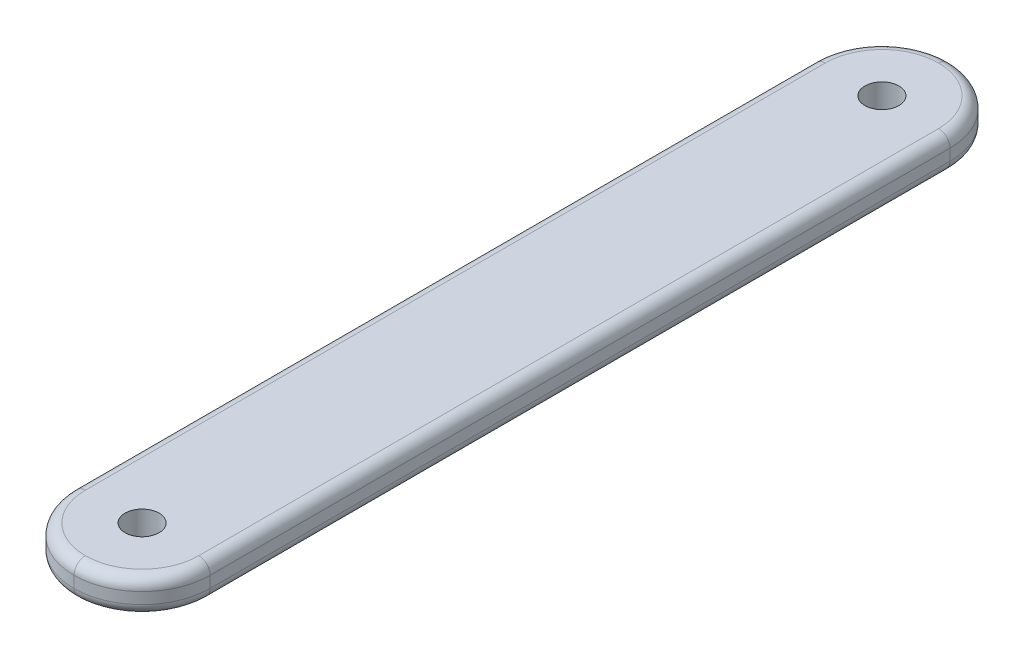
ISO-10303-21;
HEADER;
FILE_DESCRIPTION(('STEP AP214'),'2;1');
FILE_NAME('part.step','',(''),(''),'','','');
FILE_SCHEMA(('AUTOMOTIVE_DESIGN { 1 0 10303 214 1 1 1 1 }'));
ENDSEC;
DATA;
#1=APPLICATION_CONTEXT('core data for automotive mechanical design processes');
#2=APPLICATION_PROTOCOL_DEFINITION('international standard','automotive_design',2000,#1);
#3=PRODUCT_CONTEXT('',#1,'mechanical');
#4=PRODUCT('Part','Part','',(#3));
#5=PRODUCT_RELATED_PRODUCT_CATEGORY('part','',(#4));
#6=PRODUCT_DEFINITION_FORMATION('','',#4);
#7=PRODUCT_DEFINITION_CONTEXT('part definition',#1,'design');
#8=PRODUCT_DEFINITION('design','',#6,#7);
#9=PRODUCT_DEFINITION_SHAPE('','',#8);
#10=(LENGTH_UNIT() NAMED_UNIT(*) SI_UNIT(.MILLI.,.METRE.));
#11=(NAMED_UNIT(*) PLANE_ANGLE_UNIT() SI_UNIT($,.RADIAN.));
#12=(NAMED_UNIT(*) SI_UNIT($,.STERADIAN.) SOLID_ANGLE_UNIT());
#13=UNCERTAINTY_MEASURE_WITH_UNIT(LENGTH_MEASURE(1.E-05),#10,'distance_accuracy_value','');
#14=(GEOMETRIC_REPRESENTATION_CONTEXT(3) GLOBAL_UNCERTAINTY_ASSIGNED_CONTEXT((#13)) GLOBAL_UNIT_ASSIGNED_CONTEXT((#10,
#11,#12)) REPRESENTATION_CONTEXT('',''));
#15=CARTESIAN_POINT('',(0.,0.,0.));
#16=DIRECTION('',(0.,0.,1.));
#17=DIRECTION('',(1.,0.,0.));
#18=AXIS2_PLACEMENT_3D('',#15,#16,#17);
#19=CARTESIAN_POINT('',(0.,6.35,0.));
#20=DIRECTION('',(0.,-1.,0.));
#21=DIRECTION('',(0.,0.,-1.));
#22=AXIS2_PLACEMENT_3D('',#19,#20,#21);
#23=PLANE('',#22);
#24=CARTESIAN_POINT('',(0.,6.35,69.0270393288423));
#25=DIRECTION('',(0.,-1.,0.));
#26=DIRECTION('',(0.,0.,-1.));
#27=AXIS2_PLACEMENT_3D('',#24,#25,#26);
#28=CIRCLE('',#27,10.5833333333333);
#29=CARTESIAN_POINT('',(-10.5833333333333,6.35,69.0270393288423));
#30=VERTEX_POINT('',#29);
#31=CARTESIAN_POINT('',(0.,6.35,79.6103726621756));
#32=VERTEX_POINT('',#31);
#33=EDGE_CURVE('E158',#30,#32,#28,.F.);
#34=ORIENTED_EDGE('',*,*,#33,.T.);
#35=CARTESIAN_POINT('',(0.,6.35,69.0270393288423));
#36=DIRECTION('',(0.,-1.,0.));
#37=DIRECTION('',(0.,0.,-1.));
#38=AXIS2_PLACEMENT_3D('',#35,#36,#37);
#39=CIRCLE('',#38,10.5833333333333);
#40=CARTESIAN_POINT('',(10.5833333333333,6.35,69.0270393288423));
#41=VERTEX_POINT('',#40);
#42=EDGE_CURVE('E137',#32,#41,#39,.F.);
#43=ORIENTED_EDGE('',*,*,#42,.T.);
#44=DIRECTION('',(0.,0.,-1.));
#45=VECTOR('',#44,1.);
#46=CARTESIAN_POINT('',(10.5833333333333,6.35,0.));
#47=LINE('',#46,#45);
#48=CARTESIAN_POINT('',(10.5833333333333,6.35,-69.0270393288423));
#49=VERTEX_POINT('',#48);
#50=EDGE_CURVE('E146',#41,#49,#47,.T.);
#51=ORIENTED_EDGE('',*,*,#50,.T.);
#52=CARTESIAN_POINT('',(0.,6.35,-69.0270393288423));
#53=DIRECTION('',(0.,-1.,0.));
#54=DIRECTION('',(0.,0.,-1.));
#55=AXIS2_PLACEMENT_3D('',#52,#53,#54);
#56=CIRCLE('',#55,10.5833333333333);
#57=CARTESIAN_POINT('',(0.,6.35,-79.6103726621756));
#58=VERTEX_POINT('',#57);
#59=EDGE_CURVE('E153',#49,#58,#56,.F.);
#60=ORIENTED_EDGE('',*,*,#59,.T.);
#61=CARTESIAN_POINT('',(0.,6.35,-69.0270393288423));
#62=DIRECTION('',(0.,-1.,0.));
#63=DIRECTION('',(0.,0.,-1.));
#64=AXIS2_PLACEMENT_3D('',#61,#62,#63);
#65=CIRCLE('',#64,10.5833333333333);
#66=CARTESIAN_POINT('',(-10.5833333333333,6.35,-69.0270393288423));
#67=VERTEX_POINT('',#66);
#68=EDGE_CURVE('E299',#58,#67,#65,.F.);
#69=ORIENTED_EDGE('',*,*,#68,.T.);
#70=DIRECTION('',(0.,0.,1.));
#71=VECTOR('',#70,1.);
#72=CARTESIAN_POINT('',(-10.5833333333333,6.35,0.));
#73=LINE('',#72,#71);
#74=EDGE_CURVE('E167',#67,#30,#73,.T.);
#75=ORIENTED_EDGE('',*,*,#74,.T.);
#76=EDGE_LOOP('',(#34,#43,#51,#60,#69,#75));
#77=FACE_BOUND('',#76,.T.);
#78=CARTESIAN_POINT('',(0.,6.35,69.0270393288423));
#79=DIRECTION('',(0.,1.,0.));
#80=DIRECTION('',(0.,0.,1.));
#81=AXIS2_PLACEMENT_3D('',#78,#79,#80);
#82=CIRCLE('',#81,3.175);
#83=CARTESIAN_POINT('',(0.,6.35,72.2020393288423));
#84=VERTEX_POINT('',#83);
#85=EDGE_CURVE('E284',#84,#84,#82,.T.);
#86=ORIENTED_EDGE('',*,*,#85,.F.);
#87=EDGE_LOOP('',(#86));
#88=FACE_BOUND('',#87,.T.);
#89=CARTESIAN_POINT('',(0.,6.35,-69.0270393288423));
#90=DIRECTION('',(0.,1.,0.));
#91=DIRECTION('',(0.,0.,1.));
#92=AXIS2_PLACEMENT_3D('',#89,#90,#91);
#93=CIRCLE('',#92,3.17499999999999);
#94=CARTESIAN_POINT('',(0.,6.35,-65.8520393288423));
#95=VERTEX_POINT('',#94);
#96=EDGE_CURVE('E526',#95,#95,#93,.T.);
#97=ORIENTED_EDGE('',*,*,#96,.F.);
#98=EDGE_LOOP('',(#97));
#99=FACE_BOUND('',#98,.T.);
#100=ADVANCED_FACE('F39',(#77,#88,#99),#23,.F.);
#101=CARTESIAN_POINT('',(0.,0.,0.));
#102=DIRECTION('',(0.,-1.,0.));
#103=DIRECTION('',(0.,0.,-1.));
#104=AXIS2_PLACEMENT_3D('',#101,#102,#103);
#105=PLANE('',#104);
#106=DIRECTION('',(0.,0.,-1.));
#107=VECTOR('',#106,1.);
#108=CARTESIAN_POINT('',(10.5833333333333,0.,69.0270393288423));
#109=LINE('',#108,#107);
#110=CARTESIAN_POINT('',(10.5833333333333,0.,-69.0270393288423));
#111=VERTEX_POINT('',#110);
#112=CARTESIAN_POINT('',(10.5833333333333,0.,69.0270393288423));
#113=VERTEX_POINT('',#112);
#114=EDGE_CURVE('E197',#111,#113,#109,.F.);
#115=ORIENTED_EDGE('',*,*,#114,.T.);
#116=CARTESIAN_POINT('',(0.,0.,69.0270393288423));
#117=DIRECTION('',(0.,-1.,0.));
#118=DIRECTION('',(0.,0.,-1.));
#119=AXIS2_PLACEMENT_3D('',#116,#117,#118);
#120=CIRCLE('',#119,10.5833333333333);
#121=CARTESIAN_POINT('',(0.,0.,79.6103726621756));
#122=VERTEX_POINT('',#121);
#123=EDGE_CURVE('E211',#113,#122,#120,.T.);
#124=ORIENTED_EDGE('',*,*,#123,.T.);
#125=CARTESIAN_POINT('',(0.,0.,69.0270393288423));
#126=DIRECTION('',(0.,-1.,0.));
#127=DIRECTION('',(0.,0.,-1.));
#128=AXIS2_PLACEMENT_3D('',#125,#126,#127);
#129=CIRCLE('',#128,10.5833333333333);
#130=CARTESIAN_POINT('',(-10.5833333333333,0.,69.0270393288423));
#131=VERTEX_POINT('',#130);
#132=EDGE_CURVE('E64',#122,#131,#129,.T.);
#133=ORIENTED_EDGE('',*,*,#132,.T.);
#134=DIRECTION('',(0.,0.,1.));
#135=VECTOR('',#134,1.);
#136=CARTESIAN_POINT('',(-10.5833333333333,0.,-69.0270393288423));
#137=LINE('',#136,#135);
#138=CARTESIAN_POINT('',(-10.5833333333333,0.,-69.0270393288423));
#139=VERTEX_POINT('',#138);
#140=EDGE_CURVE('E206',#131,#139,#137,.F.);
#141=ORIENTED_EDGE('',*,*,#140,.T.);
#142=CARTESIAN_POINT('',(0.,0.,-69.0270393288423));
#143=DIRECTION('',(0.,-1.,0.));
#144=DIRECTION('',(0.,0.,-1.));
#145=AXIS2_PLACEMENT_3D('',#142,#143,#144);
#146=CIRCLE('',#145,10.5833333333333);
#147=CARTESIAN_POINT('',(0.,0.,-79.6103726621756));
#148=VERTEX_POINT('',#147);
#149=EDGE_CURVE('E203',#139,#148,#146,.T.);
#150=ORIENTED_EDGE('',*,*,#149,.T.);
#151=CARTESIAN_POINT('',(0.,0.,-69.0270393288423));
#152=DIRECTION('',(0.,-1.,0.));
#153=DIRECTION('',(0.,0.,-1.));
#154=AXIS2_PLACEMENT_3D('',#151,#152,#153);
#155=CIRCLE('',#154,10.5833333333333);
#156=EDGE_CURVE('E200',#148,#111,#155,.T.);
#157=ORIENTED_EDGE('',*,*,#156,.T.);
#158=EDGE_LOOP('',(#115,#124,#133,#141,#150,#157));
#159=FACE_BOUND('',#158,.T.);
#160=CARTESIAN_POINT('',(0.,0.,69.0270393288423));
#161=DIRECTION('',(0.,1.,0.));
#162=DIRECTION('',(0.,0.,1.));
#163=AXIS2_PLACEMENT_3D('',#160,#161,#162);
#164=CIRCLE('',#163,3.175);
#165=CARTESIAN_POINT('',(0.,0.,72.2020393288423));
#166=VERTEX_POINT('',#165);
#167=EDGE_CURVE('E524',#166,#166,#164,.T.);
#168=ORIENTED_EDGE('',*,*,#167,.T.);
#169=EDGE_LOOP('',(#168));
#170=FACE_BOUND('',#169,.T.);
#171=CARTESIAN_POINT('',(0.,0.,-69.0270393288423));
#172=DIRECTION('',(0.,1.,0.));
#173=DIRECTION('',(0.,0.,1.));
#174=AXIS2_PLACEMENT_3D('',#171,#172,#173);
#175=CIRCLE('',#174,3.17499999999999);
#176=CARTESIAN_POINT('',(0.,0.,-65.8520393288423));
#177=VERTEX_POINT('',#176);
#178=EDGE_CURVE('E293',#177,#177,#175,.T.);
#179=ORIENTED_EDGE('',*,*,#178,.T.);
#180=EDGE_LOOP('',(#179));
#181=FACE_BOUND('',#180,.T.);
#182=ADVANCED_FACE('F321',(#159,#170,#181),#105,.T.);
#183=CARTESIAN_POINT('',(12.7,6.35,81.7270393288423));
#184=DIRECTION('',(-1.,0.,0.));
#185=DIRECTION('',(0.,0.,1.));
#186=AXIS2_PLACEMENT_3D('',#183,#184,#185);
#187=PLANE('',#186);
#188=DIRECTION('',(0.,-1.,0.));
#189=VECTOR('',#188,1.);
#190=CARTESIAN_POINT('',(12.7,6.35,-69.0270393288423));
#191=LINE('',#190,#189);
#192=CARTESIAN_POINT('',(12.7,2.11666666666667,-69.0270393288423));
#193=VERTEX_POINT('',#192);
#194=CARTESIAN_POINT('',(12.7,4.23333333333333,-69.0270393288423));
#195=VERTEX_POINT('',#194);
#196=EDGE_CURVE('E154',#193,#195,#191,.F.);
#197=ORIENTED_EDGE('',*,*,#196,.T.);
#198=DIRECTION('',(0.,0.,-1.));
#199=VECTOR('',#198,1.);
#200=CARTESIAN_POINT('',(12.7,4.23333333333333,81.7270393288423));
#201=LINE('',#200,#199);
#202=CARTESIAN_POINT('',(12.7,4.23333333333333,69.0270393288423));
#203=VERTEX_POINT('',#202);
#204=EDGE_CURVE('E11',#195,#203,#201,.F.);
#205=ORIENTED_EDGE('',*,*,#204,.T.);
#206=DIRECTION('',(0.,-1.,0.));
#207=VECTOR('',#206,1.);
#208=CARTESIAN_POINT('',(12.7,6.35,69.0270393288423));
#209=LINE('',#208,#207);
#210=CARTESIAN_POINT('',(12.7,2.11666666666667,69.0270393288423));
#211=VERTEX_POINT('',#210);
#212=EDGE_CURVE('E277',#203,#211,#209,.T.);
#213=ORIENTED_EDGE('',*,*,#212,.T.);
#214=DIRECTION('',(0.,0.,-1.));
#215=VECTOR('',#214,1.);
#216=CARTESIAN_POINT('',(12.7,2.11666666666667,-69.0270393288423));
#217=LINE('',#216,#215);
#218=EDGE_CURVE('E49',#211,#193,#217,.T.);
#219=ORIENTED_EDGE('',*,*,#218,.T.);
#220=EDGE_LOOP('',(#197,#205,#213,#219));
#221=FACE_BOUND('',#220,.T.);
#222=ADVANCED_FACE('F331',(#221),#187,.F.);
#223=CARTESIAN_POINT('',(-12.7,6.35,81.7270393288423));
#224=DIRECTION('',(1.,0.,0.));
#225=DIRECTION('',(0.,0.,-1.));
#226=AXIS2_PLACEMENT_3D('',#223,#224,#225);
#227=PLANE('',#226);
#228=DIRECTION('',(0.,-1.,0.));
#229=VECTOR('',#228,1.);
#230=CARTESIAN_POINT('',(-12.7,6.35,69.0270393288423));
#231=LINE('',#230,#229);
#232=CARTESIAN_POINT('',(-12.7,2.11666666666667,69.0270393288423));
#233=VERTEX_POINT('',#232);
#234=CARTESIAN_POINT('',(-12.7,4.23333333333333,69.0270393288423));
#235=VERTEX_POINT('',#234);
#236=EDGE_CURVE('E278',#233,#235,#231,.F.);
#237=ORIENTED_EDGE('',*,*,#236,.T.);
#238=DIRECTION('',(0.,0.,1.));
#239=VECTOR('',#238,1.);
#240=CARTESIAN_POINT('',(-12.7,4.23333333333333,81.7270393288423));
#241=LINE('',#240,#239);
#242=CARTESIAN_POINT('',(-12.7,4.23333333333333,-69.0270393288423));
#243=VERTEX_POINT('',#242);
#244=EDGE_CURVE('E182',#235,#243,#241,.F.);
#245=ORIENTED_EDGE('',*,*,#244,.T.);
#246=DIRECTION('',(0.,-1.,0.));
#247=VECTOR('',#246,1.);
#248=CARTESIAN_POINT('',(-12.7,6.35,-69.0270393288423));
#249=LINE('',#248,#247);
#250=CARTESIAN_POINT('',(-12.7,2.11666666666667,-69.0270393288423));
#251=VERTEX_POINT('',#250);
#252=EDGE_CURVE('E267',#243,#251,#249,.T.);
#253=ORIENTED_EDGE('',*,*,#252,.T.);
#254=DIRECTION('',(0.,0.,1.));
#255=VECTOR('',#254,1.);
#256=CARTESIAN_POINT('',(-12.7,2.11666666666667,69.0270393288423));
#257=LINE('',#256,#255);
#258=EDGE_CURVE('E179',#251,#233,#257,.T.);
#259=ORIENTED_EDGE('',*,*,#258,.T.);
#260=EDGE_LOOP('',(#237,#245,#253,#259));
#261=FACE_BOUND('',#260,.T.);
#262=ADVANCED_FACE('F273',(#261),#227,.F.);
#263=CARTESIAN_POINT('',(0.,6.35,69.0270393288423));
#264=DIRECTION('',(0.,-1.,0.));
#265=DIRECTION('',(0.,0.,-1.));
#266=AXIS2_PLACEMENT_3D('',#263,#264,#265);
#267=CYLINDRICAL_SURFACE('',#266,3.175);
#268=ORIENTED_EDGE('',*,*,#85,.T.);
#269=EDGE_LOOP('',(#268));
#270=FACE_BOUND('',#269,.T.);
#271=ORIENTED_EDGE('',*,*,#167,.F.);
#272=EDGE_LOOP('',(#271));
#273=FACE_BOUND('',#272,.T.);
#274=ADVANCED_FACE('F348',(#270,#273),#267,.F.);
#275=CARTESIAN_POINT('',(0.,6.35,-69.0270393288423));
#276=DIRECTION('',(0.,-1.,0.));
#277=DIRECTION('',(0.,0.,-1.));
#278=AXIS2_PLACEMENT_3D('',#275,#276,#277);
#279=CYLINDRICAL_SURFACE('',#278,3.17499999999999);
#280=ORIENTED_EDGE('',*,*,#96,.T.);
#281=EDGE_LOOP('',(#280));
#282=FACE_BOUND('',#281,.T.);
#283=ORIENTED_EDGE('',*,*,#178,.F.);
#284=EDGE_LOOP('',(#283));
#285=FACE_BOUND('',#284,.T.);
#286=ADVANCED_FACE('F341',(#282,#285),#279,.F.);
#287=CARTESIAN_POINT('',(0.,6.35,-69.0270393288423));
#288=DIRECTION('',(0.,-1.,0.));
#289=DIRECTION('',(0.,0.,-1.));
#290=AXIS2_PLACEMENT_3D('',#287,#288,#289);
#291=CYLINDRICAL_SURFACE('',#290,12.7);
#292=DIRECTION('',(0.,-1.,0.));
#293=VECTOR('',#292,1.);
#294=CARTESIAN_POINT('',(0.,6.35,-81.7270393288423));
#295=LINE('',#294,#293);
#296=CARTESIAN_POINT('',(0.,4.23333333333333,-81.7270393288423));
#297=VERTEX_POINT('',#296);
#298=CARTESIAN_POINT('',(0.,2.11666666666667,-81.7270393288423));
#299=VERTEX_POINT('',#298);
#300=EDGE_CURVE('E270',#297,#299,#295,.T.);
#301=ORIENTED_EDGE('',*,*,#300,.F.);
#302=CARTESIAN_POINT('',(0.,4.23333333333333,-69.0270393288423));
#303=DIRECTION('',(0.,-1.,0.));
#304=DIRECTION('',(0.,0.,-1.));
#305=AXIS2_PLACEMENT_3D('',#302,#303,#304);
#306=CIRCLE('',#305,12.7);
#307=EDGE_CURVE('E194',#297,#195,#306,.T.);
#308=ORIENTED_EDGE('',*,*,#307,.T.);
#309=ORIENTED_EDGE('',*,*,#196,.F.);
#310=CARTESIAN_POINT('',(0.,2.11666666666667,-69.0270393288423));
#311=DIRECTION('',(0.,-1.,0.));
#312=DIRECTION('',(0.,0.,-1.));
#313=AXIS2_PLACEMENT_3D('',#310,#311,#312);
#314=CIRCLE('',#313,12.7);
#315=EDGE_CURVE('E191',#193,#299,#314,.F.);
#316=ORIENTED_EDGE('',*,*,#315,.T.);
#317=EDGE_LOOP('',(#301,#308,#309,#316));
#318=FACE_BOUND('',#317,.T.);
#319=ADVANCED_FACE('F339',(#318),#291,.T.);
#320=CARTESIAN_POINT('',(0.,6.35,-69.0270393288423));
#321=DIRECTION('',(0.,-1.,0.));
#322=DIRECTION('',(0.,0.,-1.));
#323=AXIS2_PLACEMENT_3D('',#320,#321,#322);
#324=CYLINDRICAL_SURFACE('',#323,12.7);
#325=ORIENTED_EDGE('',*,*,#252,.F.);
#326=CARTESIAN_POINT('',(0.,4.23333333333333,-69.0270393288423));
#327=DIRECTION('',(0.,-1.,0.));
#328=DIRECTION('',(0.,0.,-1.));
#329=AXIS2_PLACEMENT_3D('',#326,#327,#328);
#330=CIRCLE('',#329,12.7);
#331=EDGE_CURVE('E188',#243,#297,#330,.T.);
#332=ORIENTED_EDGE('',*,*,#331,.T.);
#333=ORIENTED_EDGE('',*,*,#300,.T.);
#334=CARTESIAN_POINT('',(0.,2.11666666666667,-69.0270393288423));
#335=DIRECTION('',(0.,-1.,0.));
#336=DIRECTION('',(0.,0.,-1.));
#337=AXIS2_PLACEMENT_3D('',#334,#335,#336);
#338=CIRCLE('',#337,12.7);
#339=EDGE_CURVE('E185',#299,#251,#338,.F.);
#340=ORIENTED_EDGE('',*,*,#339,.T.);
#341=EDGE_LOOP('',(#325,#332,#333,#340));
#342=FACE_BOUND('',#341,.T.);
#343=ADVANCED_FACE('F266',(#342),#324,.T.);
#344=CARTESIAN_POINT('',(0.,6.35,69.0270393288423));
#345=DIRECTION('',(0.,-1.,0.));
#346=DIRECTION('',(0.,0.,-1.));
#347=AXIS2_PLACEMENT_3D('',#344,#345,#346);
#348=CYLINDRICAL_SURFACE('',#347,12.7);
#349=ORIENTED_EDGE('',*,*,#212,.F.);
#350=CARTESIAN_POINT('',(0.,4.23333333333333,69.0270393288423));
#351=DIRECTION('',(0.,-1.,0.));
#352=DIRECTION('',(0.,0.,-1.));
#353=AXIS2_PLACEMENT_3D('',#350,#351,#352);
#354=CIRCLE('',#353,12.7);
#355=CARTESIAN_POINT('',(0.,4.23333333333333,81.7270393288423));
#356=VERTEX_POINT('',#355);
#357=EDGE_CURVE('E139',#203,#356,#354,.T.);
#358=ORIENTED_EDGE('',*,*,#357,.T.);
#359=DIRECTION('',(0.,-1.,0.));
#360=VECTOR('',#359,1.);
#361=CARTESIAN_POINT('',(0.,6.35,81.7270393288423));
#362=LINE('',#361,#360);
#363=CARTESIAN_POINT('',(0.,2.11666666666667,81.7270393288423));
#364=VERTEX_POINT('',#363);
#365=EDGE_CURVE('E232',#364,#356,#362,.F.);
#366=ORIENTED_EDGE('',*,*,#365,.F.);
#367=CARTESIAN_POINT('',(0.,2.11666666666667,69.0270393288423));
#368=DIRECTION('',(0.,-1.,0.));
#369=DIRECTION('',(0.,0.,-1.));
#370=AXIS2_PLACEMENT_3D('',#367,#368,#369);
#371=CIRCLE('',#370,12.7);
#372=EDGE_CURVE('E161',#364,#211,#371,.F.);
#373=ORIENTED_EDGE('',*,*,#372,.T.);
#374=EDGE_LOOP('',(#349,#358,#366,#373));
#375=FACE_BOUND('',#374,.T.);
#376=ADVANCED_FACE('F315',(#375),#348,.T.);
#377=CARTESIAN_POINT('',(0.,6.35,69.0270393288423));
#378=DIRECTION('',(0.,-1.,0.));
#379=DIRECTION('',(0.,0.,-1.));
#380=AXIS2_PLACEMENT_3D('',#377,#378,#379);
#381=CYLINDRICAL_SURFACE('',#380,12.7);
#382=ORIENTED_EDGE('',*,*,#365,.T.);
#383=CARTESIAN_POINT('',(0.,4.23333333333333,69.0270393288423));
#384=DIRECTION('',(0.,-1.,0.));
#385=DIRECTION('',(0.,0.,-1.));
#386=AXIS2_PLACEMENT_3D('',#383,#384,#385);
#387=CIRCLE('',#386,12.7);
#388=EDGE_CURVE('E176',#356,#235,#387,.T.);
#389=ORIENTED_EDGE('',*,*,#388,.T.);
#390=ORIENTED_EDGE('',*,*,#236,.F.);
#391=CARTESIAN_POINT('',(0.,2.11666666666667,69.0270393288423));
#392=DIRECTION('',(0.,-1.,0.));
#393=DIRECTION('',(0.,0.,-1.));
#394=AXIS2_PLACEMENT_3D('',#391,#392,#393);
#395=CIRCLE('',#394,12.7);
#396=EDGE_CURVE('E173',#233,#364,#395,.F.);
#397=ORIENTED_EDGE('',*,*,#396,.T.);
#398=EDGE_LOOP('',(#382,#389,#390,#397));
#399=FACE_BOUND('',#398,.T.);
#400=ADVANCED_FACE('F316',(#399),#381,.T.);
#401=CARTESIAN_POINT('',(0.,4.23333333333333,-69.0270393288423));
#402=DIRECTION('',(0.,-1.,0.));
#403=DIRECTION('',(0.,0.,-1.));
#404=AXIS2_PLACEMENT_3D('',#401,#402,#403);
#405=TOROIDAL_SURFACE('',#404,10.5833333333333,2.11666666666667);
#406=CARTESIAN_POINT('',(0.,4.23333333333333,-79.6103726621756));
#407=DIRECTION('',(1.,0.,0.));
#408=DIRECTION('',(0.,0.,-1.));
#409=AXIS2_PLACEMENT_3D('',#406,#407,#408);
#410=CIRCLE('',#409,2.11666666666667);
#411=EDGE_CURVE('E224',#297,#58,#410,.T.);
#412=ORIENTED_EDGE('',*,*,#411,.F.);
#413=ORIENTED_EDGE('',*,*,#331,.F.);
#414=CARTESIAN_POINT('',(-10.5833333333333,4.23333333333333,-69.0270393288423));
#415=DIRECTION('',(0.,0.,1.));
#416=DIRECTION('',(1.,0.,0.));
#417=AXIS2_PLACEMENT_3D('',#414,#415,#416);
#418=CIRCLE('',#417,2.11666666666667);
#419=EDGE_CURVE('E228',#67,#243,#418,.T.);
#420=ORIENTED_EDGE('',*,*,#419,.F.);
#421=ORIENTED_EDGE('',*,*,#68,.F.);
#422=EDGE_LOOP('',(#412,#413,#420,#421));
#423=FACE_BOUND('',#422,.T.);
#424=ADVANCED_FACE('F338',(#423),#405,.T.);
#425=CARTESIAN_POINT('',(-10.5833333333333,4.23333333333333,0.));
#426=DIRECTION('',(0.,0.,1.));
#427=DIRECTION('',(1.,0.,0.));
#428=AXIS2_PLACEMENT_3D('',#425,#426,#427);
#429=CYLINDRICAL_SURFACE('',#428,2.11666666666667);
#430=ORIENTED_EDGE('',*,*,#419,.T.);
#431=ORIENTED_EDGE('',*,*,#244,.F.);
#432=CARTESIAN_POINT('',(-10.5833333333333,4.23333333333333,69.0270393288423));
#433=DIRECTION('',(0.,0.,1.));
#434=DIRECTION('',(1.,0.,0.));
#435=AXIS2_PLACEMENT_3D('',#432,#433,#434);
#436=CIRCLE('',#435,2.11666666666667);
#437=EDGE_CURVE('E220',#30,#235,#436,.T.);
#438=ORIENTED_EDGE('',*,*,#437,.F.);
#439=ORIENTED_EDGE('',*,*,#74,.F.);
#440=EDGE_LOOP('',(#430,#431,#438,#439));
#441=FACE_BOUND('',#440,.T.);
#442=ADVANCED_FACE('F307',(#441),#429,.T.);
#443=CARTESIAN_POINT('',(0.,4.23333333333333,-69.0270393288423));
#444=DIRECTION('',(0.,-1.,0.));
#445=DIRECTION('',(0.,0.,-1.));
#446=AXIS2_PLACEMENT_3D('',#443,#444,#445);
#447=TOROIDAL_SURFACE('',#446,10.5833333333333,2.11666666666667);
#448=ORIENTED_EDGE('',*,*,#411,.T.);
#449=ORIENTED_EDGE('',*,*,#59,.F.);
#450=CARTESIAN_POINT('',(10.5833333333333,4.23333333333333,-69.0270393288423));
#451=DIRECTION('',(0.,0.,1.));
#452=DIRECTION('',(1.,0.,0.));
#453=AXIS2_PLACEMENT_3D('',#450,#451,#452);
#454=CIRCLE('',#453,2.11666666666667);
#455=EDGE_CURVE('E149',#195,#49,#454,.T.);
#456=ORIENTED_EDGE('',*,*,#455,.F.);
#457=ORIENTED_EDGE('',*,*,#307,.F.);
#458=EDGE_LOOP('',(#448,#449,#456,#457));
#459=FACE_BOUND('',#458,.T.);
#460=ADVANCED_FACE('F335',(#459),#447,.T.);
#461=CARTESIAN_POINT('',(0.,4.23333333333333,69.0270393288423));
#462=DIRECTION('',(0.,-1.,0.));
#463=DIRECTION('',(0.,0.,-1.));
#464=AXIS2_PLACEMENT_3D('',#461,#462,#463);
#465=TOROIDAL_SURFACE('',#464,10.5833333333333,2.11666666666667);
#466=ORIENTED_EDGE('',*,*,#437,.T.);
#467=ORIENTED_EDGE('',*,*,#388,.F.);
#468=CARTESIAN_POINT('',(0.,4.23333333333333,79.6103726621756));
#469=DIRECTION('',(1.,0.,0.));
#470=DIRECTION('',(0.,0.,-1.));
#471=AXIS2_PLACEMENT_3D('',#468,#469,#470);
#472=CIRCLE('',#471,2.11666666666667);
#473=EDGE_CURVE('E143',#32,#356,#472,.T.);
#474=ORIENTED_EDGE('',*,*,#473,.F.);
#475=ORIENTED_EDGE('',*,*,#33,.F.);
#476=EDGE_LOOP('',(#466,#467,#474,#475));
#477=FACE_BOUND('',#476,.T.);
#478=ADVANCED_FACE('F310',(#477),#465,.T.);
#479=CARTESIAN_POINT('',(10.5833333333333,4.23333333333333,0.));
#480=DIRECTION('',(0.,0.,-1.));
#481=DIRECTION('',(-1.,0.,0.));
#482=AXIS2_PLACEMENT_3D('',#479,#480,#481);
#483=CYLINDRICAL_SURFACE('',#482,2.11666666666667);
#484=ORIENTED_EDGE('',*,*,#455,.T.);
#485=ORIENTED_EDGE('',*,*,#50,.F.);
#486=CARTESIAN_POINT('',(10.5833333333333,4.23333333333333,69.0270393288423));
#487=DIRECTION('',(0.,0.,1.));
#488=DIRECTION('',(1.,0.,0.));
#489=AXIS2_PLACEMENT_3D('',#486,#487,#488);
#490=CIRCLE('',#489,2.11666666666667);
#491=EDGE_CURVE('E133',#203,#41,#490,.T.);
#492=ORIENTED_EDGE('',*,*,#491,.F.);
#493=ORIENTED_EDGE('',*,*,#204,.F.);
#494=EDGE_LOOP('',(#484,#485,#492,#493));
#495=FACE_BOUND('',#494,.T.);
#496=ADVANCED_FACE('F147',(#495),#483,.T.);
#497=CARTESIAN_POINT('',(0.,4.23333333333333,69.0270393288423));
#498=DIRECTION('',(0.,-1.,0.));
#499=DIRECTION('',(0.,0.,-1.));
#500=AXIS2_PLACEMENT_3D('',#497,#498,#499);
#501=TOROIDAL_SURFACE('',#500,10.5833333333333,2.11666666666667);
#502=ORIENTED_EDGE('',*,*,#473,.T.);
#503=ORIENTED_EDGE('',*,*,#357,.F.);
#504=ORIENTED_EDGE('',*,*,#491,.T.);
#505=ORIENTED_EDGE('',*,*,#42,.F.);
#506=EDGE_LOOP('',(#502,#503,#504,#505));
#507=FACE_BOUND('',#506,.T.);
#508=ADVANCED_FACE('F135',(#507),#501,.T.);
#509=CARTESIAN_POINT('',(0.,2.11666666666667,-69.0270393288423));
#510=DIRECTION('',(0.,-1.,0.));
#511=DIRECTION('',(0.,0.,-1.));
#512=AXIS2_PLACEMENT_3D('',#509,#510,#511);
#513=TOROIDAL_SURFACE('',#512,10.5833333333333,2.11666666666667);
#514=CARTESIAN_POINT('',(-10.5833333333333,2.11666666666667,-69.0270393288423));
#515=DIRECTION('',(0.,0.,1.));
#516=DIRECTION('',(1.,0.,0.));
#517=AXIS2_PLACEMENT_3D('',#514,#515,#516);
#518=CIRCLE('',#517,2.11666666666667);
#519=EDGE_CURVE('E245',#251,#139,#518,.T.);
#520=ORIENTED_EDGE('',*,*,#519,.F.);
#521=ORIENTED_EDGE('',*,*,#339,.F.);
#522=CARTESIAN_POINT('',(0.,2.11666666666667,-79.6103726621756));
#523=DIRECTION('',(1.,0.,0.));
#524=DIRECTION('',(0.,0.,-1.));
#525=AXIS2_PLACEMENT_3D('',#522,#523,#524);
#526=CIRCLE('',#525,2.11666666666667);
#527=EDGE_CURVE('E43',#148,#299,#526,.T.);
#528=ORIENTED_EDGE('',*,*,#527,.F.);
#529=ORIENTED_EDGE('',*,*,#149,.F.);
#530=EDGE_LOOP('',(#520,#521,#528,#529));
#531=FACE_BOUND('',#530,.T.);
#532=ADVANCED_FACE('F41',(#531),#513,.T.);
#533=CARTESIAN_POINT('',(0.,2.11666666666667,-69.0270393288423));
#534=DIRECTION('',(0.,-1.,0.));
#535=DIRECTION('',(0.,0.,-1.));
#536=AXIS2_PLACEMENT_3D('',#533,#534,#535);
#537=TOROIDAL_SURFACE('',#536,10.5833333333333,2.11666666666667);
#538=ORIENTED_EDGE('',*,*,#527,.T.);
#539=ORIENTED_EDGE('',*,*,#315,.F.);
#540=CARTESIAN_POINT('',(10.5833333333333,2.11666666666667,-69.0270393288423));
#541=DIRECTION('',(0.,0.,1.));
#542=DIRECTION('',(1.,0.,0.));
#543=AXIS2_PLACEMENT_3D('',#540,#541,#542);
#544=CIRCLE('',#543,2.11666666666667);
#545=EDGE_CURVE('E242',#111,#193,#544,.T.);
#546=ORIENTED_EDGE('',*,*,#545,.F.);
#547=ORIENTED_EDGE('',*,*,#156,.F.);
#548=EDGE_LOOP('',(#538,#539,#546,#547));
#549=FACE_BOUND('',#548,.T.);
#550=ADVANCED_FACE('F257',(#549),#537,.T.);
#551=CARTESIAN_POINT('',(-10.5833333333333,2.11666666666667,81.7270393288423));
#552=DIRECTION('',(0.,0.,-1.));
#553=DIRECTION('',(-1.,0.,0.));
#554=AXIS2_PLACEMENT_3D('',#551,#552,#553);
#555=CYLINDRICAL_SURFACE('',#554,2.11666666666667);
#556=ORIENTED_EDGE('',*,*,#519,.T.);
#557=ORIENTED_EDGE('',*,*,#140,.F.);
#558=CARTESIAN_POINT('',(-10.5833333333333,2.11666666666667,69.0270393288423));
#559=DIRECTION('',(0.,0.,1.));
#560=DIRECTION('',(1.,0.,0.));
#561=AXIS2_PLACEMENT_3D('',#558,#559,#560);
#562=CIRCLE('',#561,2.11666666666667);
#563=EDGE_CURVE('E238',#233,#131,#562,.T.);
#564=ORIENTED_EDGE('',*,*,#563,.F.);
#565=ORIENTED_EDGE('',*,*,#258,.F.);
#566=EDGE_LOOP('',(#556,#557,#564,#565));
#567=FACE_BOUND('',#566,.T.);
#568=ADVANCED_FACE('F475',(#567),#555,.T.);
#569=CARTESIAN_POINT('',(10.5833333333334,2.11666666666667,81.7270393288423));
#570=DIRECTION('',(0.,0.,1.));
#571=DIRECTION('',(1.,0.,0.));
#572=AXIS2_PLACEMENT_3D('',#569,#570,#571);
#573=CYLINDRICAL_SURFACE('',#572,2.11666666666667);
#574=ORIENTED_EDGE('',*,*,#545,.T.);
#575=ORIENTED_EDGE('',*,*,#218,.F.);
#576=CARTESIAN_POINT('',(10.5833333333333,2.11666666666667,69.0270393288423));
#577=DIRECTION('',(0.,0.,1.));
#578=DIRECTION('',(1.,0.,0.));
#579=AXIS2_PLACEMENT_3D('',#576,#577,#578);
#580=CIRCLE('',#579,2.11666666666667);
#581=EDGE_CURVE('E235',#113,#211,#580,.T.);
#582=ORIENTED_EDGE('',*,*,#581,.F.);
#583=ORIENTED_EDGE('',*,*,#114,.F.);
#584=EDGE_LOOP('',(#574,#575,#582,#583));
#585=FACE_BOUND('',#584,.T.);
#586=ADVANCED_FACE('F328',(#585),#573,.T.);
#587=CARTESIAN_POINT('',(0.,2.11666666666667,69.0270393288423));
#588=DIRECTION('',(0.,-1.,0.));
#589=DIRECTION('',(0.,0.,-1.));
#590=AXIS2_PLACEMENT_3D('',#587,#588,#589);
#591=TOROIDAL_SURFACE('',#590,10.5833333333333,2.11666666666667);
#592=ORIENTED_EDGE('',*,*,#563,.T.);
#593=ORIENTED_EDGE('',*,*,#132,.F.);
#594=CARTESIAN_POINT('',(0.,2.11666666666667,79.6103726621756));
#595=DIRECTION('',(1.,0.,0.));
#596=DIRECTION('',(0.,0.,-1.));
#597=AXIS2_PLACEMENT_3D('',#594,#595,#596);
#598=CIRCLE('',#597,2.11666666666667);
#599=EDGE_CURVE('E57',#364,#122,#598,.T.);
#600=ORIENTED_EDGE('',*,*,#599,.F.);
#601=ORIENTED_EDGE('',*,*,#396,.F.);
#602=EDGE_LOOP('',(#592,#593,#600,#601));
#603=FACE_BOUND('',#602,.T.);
#604=ADVANCED_FACE('F320',(#603),#591,.T.);
#605=CARTESIAN_POINT('',(0.,2.11666666666667,69.0270393288423));
#606=DIRECTION('',(0.,-1.,0.));
#607=DIRECTION('',(0.,0.,-1.));
#608=AXIS2_PLACEMENT_3D('',#605,#606,#607);
#609=TOROIDAL_SURFACE('',#608,10.5833333333333,2.11666666666667);
#610=ORIENTED_EDGE('',*,*,#581,.T.);
#611=ORIENTED_EDGE('',*,*,#372,.F.);
#612=ORIENTED_EDGE('',*,*,#599,.T.);
#613=ORIENTED_EDGE('',*,*,#123,.F.);
#614=EDGE_LOOP('',(#610,#611,#612,#613));
#615=FACE_BOUND('',#614,.T.);
#616=ADVANCED_FACE('F325',(#615),#609,.T.);
#617=CLOSED_SHELL('',(#100,#182,#222,#262,#274,#286,#319,#343,#376,#400,#424,#442,#460,#478,
#496,#508,#532,#550,#568,#586,#604,#616));
#618=MANIFOLD_SOLID_BREP('B2',#617);
#619=ADVANCED_BREP_SHAPE_REPRESENTATION('',(#18,#618),#14);
#620=SHAPE_DEFINITION_REPRESENTATION(#9,#619);
ENDSEC;
END-ISO-10303-21;
